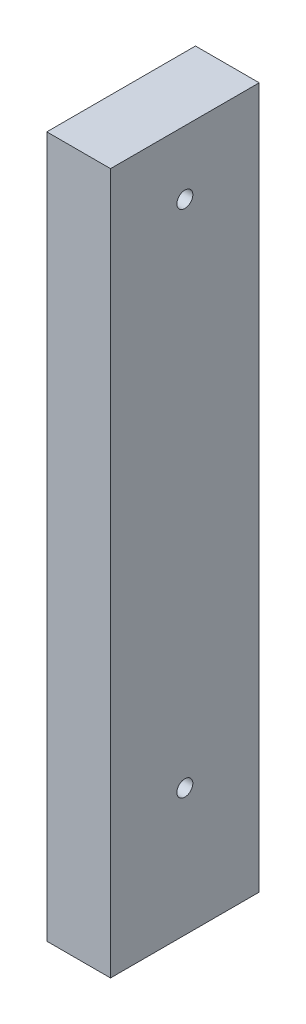
ISO-10303-21;
HEADER;
FILE_DESCRIPTION(('STEP AP214'),'2;1');
FILE_NAME('part.step','',(''),(''),'','','');
FILE_SCHEMA(('AUTOMOTIVE_DESIGN { 1 0 10303 214 1 1 1 1 }'));
ENDSEC;
DATA;
#1=APPLICATION_CONTEXT('core data for automotive mechanical design processes');
#2=APPLICATION_PROTOCOL_DEFINITION('international standard','automotive_design',2000,#1);
#3=PRODUCT_CONTEXT('',#1,'mechanical');
#4=PRODUCT('Part','Part','',(#3));
#5=PRODUCT_RELATED_PRODUCT_CATEGORY('part','',(#4));
#6=PRODUCT_DEFINITION_FORMATION('','',#4);
#7=PRODUCT_DEFINITION_CONTEXT('part definition',#1,'design');
#8=PRODUCT_DEFINITION('design','',#6,#7);
#9=PRODUCT_DEFINITION_SHAPE('','',#8);
#10=(LENGTH_UNIT() NAMED_UNIT(*) SI_UNIT(.MILLI.,.METRE.));
#11=(NAMED_UNIT(*) PLANE_ANGLE_UNIT() SI_UNIT($,.RADIAN.));
#12=(NAMED_UNIT(*) SI_UNIT($,.STERADIAN.) SOLID_ANGLE_UNIT());
#13=UNCERTAINTY_MEASURE_WITH_UNIT(LENGTH_MEASURE(1.E-05),#10,'distance_accuracy_value','');
#14=(GEOMETRIC_REPRESENTATION_CONTEXT(3) GLOBAL_UNCERTAINTY_ASSIGNED_CONTEXT((#13)) GLOBAL_UNIT_ASSIGNED_CONTEXT((#10,
#11,#12)) REPRESENTATION_CONTEXT('',''));
#15=CARTESIAN_POINT('',(0.,0.,0.));
#16=DIRECTION('',(0.,0.,1.));
#17=DIRECTION('',(1.,0.,0.));
#18=AXIS2_PLACEMENT_3D('',#15,#16,#17);
#19=CARTESIAN_POINT('',(0.,419.1,0.));
#20=DIRECTION('',(1.,0.,0.));
#21=DIRECTION('',(0.,0.,-1.));
#22=AXIS2_PLACEMENT_3D('',#19,#20,#21);
#23=PLANE('',#22);
#24=CARTESIAN_POINT('',(0.,76.2,-44.45));
#25=DIRECTION('',(-1.,0.,0.));
#26=DIRECTION('',(0.,0.,1.));
#27=AXIS2_PLACEMENT_3D('',#24,#25,#26);
#28=CIRCLE('',#27,4.7625);
#29=CARTESIAN_POINT('',(0.,76.2,-39.6875));
#30=VERTEX_POINT('',#29);
#31=EDGE_CURVE('E128',#30,#30,#28,.T.);
#32=ORIENTED_EDGE('',*,*,#31,.F.);
#33=EDGE_LOOP('',(#32));
#34=FACE_BOUND('',#33,.T.);
#35=CARTESIAN_POINT('',(0.,381.,-44.45));
#36=DIRECTION('',(-1.,0.,0.));
#37=DIRECTION('',(0.,0.,1.));
#38=AXIS2_PLACEMENT_3D('',#35,#36,#37);
#39=CIRCLE('',#38,4.7625);
#40=CARTESIAN_POINT('',(0.,381.,-39.6875));
#41=VERTEX_POINT('',#40);
#42=EDGE_CURVE('E122',#41,#41,#39,.T.);
#43=ORIENTED_EDGE('',*,*,#42,.F.);
#44=EDGE_LOOP('',(#43));
#45=FACE_BOUND('',#44,.T.);
#46=DIRECTION('',(0.,0.,1.));
#47=VECTOR('',#46,1.);
#48=CARTESIAN_POINT('',(0.,0.,0.));
#49=LINE('',#48,#47);
#50=CARTESIAN_POINT('',(0.,0.,-88.9));
#51=VERTEX_POINT('',#50);
#52=CARTESIAN_POINT('',(0.,0.,0.));
#53=VERTEX_POINT('',#52);
#54=EDGE_CURVE('E108',#51,#53,#49,.T.);
#55=ORIENTED_EDGE('',*,*,#54,.T.);
#56=DIRECTION('',(0.,-1.,0.));
#57=VECTOR('',#56,1.);
#58=CARTESIAN_POINT('',(0.,419.1,0.));
#59=LINE('',#58,#57);
#60=CARTESIAN_POINT('',(0.,419.1,0.));
#61=VERTEX_POINT('',#60);
#62=EDGE_CURVE('E14',#61,#53,#59,.T.);
#63=ORIENTED_EDGE('',*,*,#62,.F.);
#64=DIRECTION('',(0.,0.,1.));
#65=VECTOR('',#64,1.);
#66=CARTESIAN_POINT('',(0.,419.1,0.));
#67=LINE('',#66,#65);
#68=CARTESIAN_POINT('',(0.,419.1,-88.9));
#69=VERTEX_POINT('',#68);
#70=EDGE_CURVE('E96',#69,#61,#67,.T.);
#71=ORIENTED_EDGE('',*,*,#70,.F.);
#72=DIRECTION('',(0.,-1.,0.));
#73=VECTOR('',#72,1.);
#74=CARTESIAN_POINT('',(0.,419.1,-88.9));
#75=LINE('',#74,#73);
#76=EDGE_CURVE('E104',#69,#51,#75,.T.);
#77=ORIENTED_EDGE('',*,*,#76,.T.);
#78=EDGE_LOOP('',(#55,#63,#71,#77));
#79=FACE_BOUND('',#78,.T.);
#80=ADVANCED_FACE('F45',(#34,#45,#79),#23,.F.);
#81=CARTESIAN_POINT('',(0.,419.1,0.));
#82=DIRECTION('',(0.,0.,-1.));
#83=DIRECTION('',(-1.,0.,0.));
#84=AXIS2_PLACEMENT_3D('',#81,#82,#83);
#85=PLANE('',#84);
#86=DIRECTION('',(1.,0.,0.));
#87=VECTOR('',#86,1.);
#88=CARTESIAN_POINT('',(0.,0.,0.));
#89=LINE('',#88,#87);
#90=CARTESIAN_POINT('',(38.1,0.,0.));
#91=VERTEX_POINT('',#90);
#92=EDGE_CURVE('E100',#53,#91,#89,.T.);
#93=ORIENTED_EDGE('',*,*,#92,.T.);
#94=DIRECTION('',(0.,-1.,0.));
#95=VECTOR('',#94,1.);
#96=CARTESIAN_POINT('',(38.1,419.1,0.));
#97=LINE('',#96,#95);
#98=CARTESIAN_POINT('',(38.1,419.1,0.));
#99=VERTEX_POINT('',#98);
#100=EDGE_CURVE('E53',#99,#91,#97,.T.);
#101=ORIENTED_EDGE('',*,*,#100,.F.);
#102=DIRECTION('',(1.,0.,0.));
#103=VECTOR('',#102,1.);
#104=CARTESIAN_POINT('',(0.,419.1,0.));
#105=LINE('',#104,#103);
#106=EDGE_CURVE('E91',#61,#99,#105,.T.);
#107=ORIENTED_EDGE('',*,*,#106,.F.);
#108=ORIENTED_EDGE('',*,*,#62,.T.);
#109=EDGE_LOOP('',(#93,#101,#107,#108));
#110=FACE_BOUND('',#109,.T.);
#111=ADVANCED_FACE('F99',(#110),#85,.F.);
#112=CARTESIAN_POINT('',(38.1,419.1,0.));
#113=DIRECTION('',(-1.,0.,0.));
#114=DIRECTION('',(0.,0.,1.));
#115=AXIS2_PLACEMENT_3D('',#112,#113,#114);
#116=PLANE('',#115);
#117=CARTESIAN_POINT('',(38.1,76.2,-44.45));
#118=DIRECTION('',(-1.,0.,0.));
#119=DIRECTION('',(0.,0.,1.));
#120=AXIS2_PLACEMENT_3D('',#117,#118,#119);
#121=CIRCLE('',#120,4.7625);
#122=CARTESIAN_POINT('',(38.1,76.2,-39.6875));
#123=VERTEX_POINT('',#122);
#124=EDGE_CURVE('E125',#123,#123,#121,.T.);
#125=ORIENTED_EDGE('',*,*,#124,.T.);
#126=EDGE_LOOP('',(#125));
#127=FACE_BOUND('',#126,.T.);
#128=CARTESIAN_POINT('',(38.1,381.,-44.45));
#129=DIRECTION('',(-1.,0.,0.));
#130=DIRECTION('',(0.,0.,1.));
#131=AXIS2_PLACEMENT_3D('',#128,#129,#130);
#132=CIRCLE('',#131,4.7625);
#133=CARTESIAN_POINT('',(38.1,381.,-39.6875));
#134=VERTEX_POINT('',#133);
#135=EDGE_CURVE('E111',#134,#134,#132,.T.);
#136=ORIENTED_EDGE('',*,*,#135,.T.);
#137=EDGE_LOOP('',(#136));
#138=FACE_BOUND('',#137,.T.);
#139=DIRECTION('',(0.,0.,-1.));
#140=VECTOR('',#139,1.);
#141=CARTESIAN_POINT('',(38.1,0.,0.));
#142=LINE('',#141,#140);
#143=CARTESIAN_POINT('',(38.1,0.,-88.9));
#144=VERTEX_POINT('',#143);
#145=EDGE_CURVE('E78',#91,#144,#142,.T.);
#146=ORIENTED_EDGE('',*,*,#145,.T.);
#147=DIRECTION('',(0.,-1.,0.));
#148=VECTOR('',#147,1.);
#149=CARTESIAN_POINT('',(38.1,419.1,-88.9));
#150=LINE('',#149,#148);
#151=CARTESIAN_POINT('',(38.1,419.1,-88.9));
#152=VERTEX_POINT('',#151);
#153=EDGE_CURVE('E101',#152,#144,#150,.T.);
#154=ORIENTED_EDGE('',*,*,#153,.F.);
#155=DIRECTION('',(0.,0.,-1.));
#156=VECTOR('',#155,1.);
#157=CARTESIAN_POINT('',(38.1,419.1,0.));
#158=LINE('',#157,#156);
#159=EDGE_CURVE('E94',#99,#152,#158,.T.);
#160=ORIENTED_EDGE('',*,*,#159,.F.);
#161=ORIENTED_EDGE('',*,*,#100,.T.);
#162=EDGE_LOOP('',(#146,#154,#160,#161));
#163=FACE_BOUND('',#162,.T.);
#164=ADVANCED_FACE('F102',(#127,#138,#163),#116,.F.);
#165=CARTESIAN_POINT('',(0.,419.1,-88.9));
#166=DIRECTION('',(0.,0.,1.));
#167=DIRECTION('',(1.,0.,0.));
#168=AXIS2_PLACEMENT_3D('',#165,#166,#167);
#169=PLANE('',#168);
#170=DIRECTION('',(-1.,0.,0.));
#171=VECTOR('',#170,1.);
#172=CARTESIAN_POINT('',(0.,0.,-88.9));
#173=LINE('',#172,#171);
#174=EDGE_CURVE('E84',#144,#51,#173,.T.);
#175=ORIENTED_EDGE('',*,*,#174,.T.);
#176=ORIENTED_EDGE('',*,*,#76,.F.);
#177=DIRECTION('',(-1.,0.,0.));
#178=VECTOR('',#177,1.);
#179=CARTESIAN_POINT('',(0.,419.1,-88.9));
#180=LINE('',#179,#178);
#181=EDGE_CURVE('E61',#152,#69,#180,.T.);
#182=ORIENTED_EDGE('',*,*,#181,.F.);
#183=ORIENTED_EDGE('',*,*,#153,.T.);
#184=EDGE_LOOP('',(#175,#176,#182,#183));
#185=FACE_BOUND('',#184,.T.);
#186=ADVANCED_FACE('F116',(#185),#169,.F.);
#187=CARTESIAN_POINT('',(0.,419.1,0.));
#188=DIRECTION('',(0.,-1.,0.));
#189=DIRECTION('',(0.,0.,-1.));
#190=AXIS2_PLACEMENT_3D('',#187,#188,#189);
#191=PLANE('',#190);
#192=ORIENTED_EDGE('',*,*,#70,.T.);
#193=ORIENTED_EDGE('',*,*,#106,.T.);
#194=ORIENTED_EDGE('',*,*,#159,.T.);
#195=ORIENTED_EDGE('',*,*,#181,.T.);
#196=EDGE_LOOP('',(#192,#193,#194,#195));
#197=FACE_BOUND('',#196,.T.);
#198=ADVANCED_FACE('F92',(#197),#191,.F.);
#199=CARTESIAN_POINT('',(0.,0.,0.));
#200=DIRECTION('',(0.,-1.,0.));
#201=DIRECTION('',(0.,0.,-1.));
#202=AXIS2_PLACEMENT_3D('',#199,#200,#201);
#203=PLANE('',#202);
#204=ORIENTED_EDGE('',*,*,#54,.F.);
#205=ORIENTED_EDGE('',*,*,#174,.F.);
#206=ORIENTED_EDGE('',*,*,#145,.F.);
#207=ORIENTED_EDGE('',*,*,#92,.F.);
#208=EDGE_LOOP('',(#204,#205,#206,#207));
#209=FACE_BOUND('',#208,.T.);
#210=ADVANCED_FACE('F119',(#209),#203,.T.);
#211=CARTESIAN_POINT('',(38.1,381.,-44.45));
#212=DIRECTION('',(-1.,0.,0.));
#213=DIRECTION('',(0.,0.,1.));
#214=AXIS2_PLACEMENT_3D('',#211,#212,#213);
#215=CYLINDRICAL_SURFACE('',#214,4.7625);
#216=CARTESIAN_POINT('',(38.1,381.,-39.6875));
#217=CARTESIAN_POINT('',(37.703125,381.,-39.6875));
#218=CARTESIAN_POINT('',(37.30625,381.,-39.6875));
#219=CARTESIAN_POINT('',(36.5125,381.,-39.6875));
#220=CARTESIAN_POINT('',(36.115625,381.,-39.6875));
#221=CARTESIAN_POINT('',(35.321875,381.,-39.6875));
#222=CARTESIAN_POINT('',(34.925,381.,-39.6875));
#223=CARTESIAN_POINT('',(34.13125,381.,-39.6875));
#224=CARTESIAN_POINT('',(33.734375,381.,-39.6875));
#225=CARTESIAN_POINT('',(32.940625,381.,-39.6875));
#226=CARTESIAN_POINT('',(32.54375,381.,-39.6875));
#227=CARTESIAN_POINT('',(31.75,381.,-39.6875));
#228=CARTESIAN_POINT('',(31.353125,381.,-39.6875));
#229=CARTESIAN_POINT('',(30.559375,381.,-39.6875));
#230=CARTESIAN_POINT('',(30.1625,381.,-39.6875));
#231=CARTESIAN_POINT('',(29.36875,381.,-39.6875));
#232=CARTESIAN_POINT('',(28.971875,381.,-39.6875));
#233=CARTESIAN_POINT('',(28.178125,381.,-39.6875));
#234=CARTESIAN_POINT('',(27.78125,381.,-39.6875));
#235=CARTESIAN_POINT('',(26.9875,381.,-39.6875));
#236=CARTESIAN_POINT('',(26.590625,381.,-39.6875));
#237=CARTESIAN_POINT('',(25.796875,381.,-39.6875));
#238=CARTESIAN_POINT('',(25.4,381.,-39.6875));
#239=CARTESIAN_POINT('',(24.60625,381.,-39.6875));
#240=CARTESIAN_POINT('',(24.209375,381.,-39.6875));
#241=CARTESIAN_POINT('',(23.415625,381.,-39.6875));
#242=CARTESIAN_POINT('',(23.01875,381.,-39.6875));
#243=CARTESIAN_POINT('',(22.225,381.,-39.6875));
#244=CARTESIAN_POINT('',(21.828125,381.,-39.6875));
#245=CARTESIAN_POINT('',(21.034375,381.,-39.6875));
#246=CARTESIAN_POINT('',(20.6375,381.,-39.6875));
#247=CARTESIAN_POINT('',(19.84375,381.,-39.6875));
#248=CARTESIAN_POINT('',(19.446875,381.,-39.6875));
#249=CARTESIAN_POINT('',(18.653125,381.,-39.6875));
#250=CARTESIAN_POINT('',(18.25625,381.,-39.6875));
#251=CARTESIAN_POINT('',(17.4625,381.,-39.6875));
#252=CARTESIAN_POINT('',(17.065625,381.,-39.6875));
#253=CARTESIAN_POINT('',(16.271875,381.,-39.6875));
#254=CARTESIAN_POINT('',(15.875,381.,-39.6875));
#255=CARTESIAN_POINT('',(15.08125,381.,-39.6875));
#256=CARTESIAN_POINT('',(14.684375,381.,-39.6875));
#257=CARTESIAN_POINT('',(13.890625,381.,-39.6875));
#258=CARTESIAN_POINT('',(13.49375,381.,-39.6875));
#259=CARTESIAN_POINT('',(12.7,381.,-39.6875));
#260=CARTESIAN_POINT('',(12.303125,381.,-39.6875));
#261=CARTESIAN_POINT('',(11.509375,381.,-39.6875));
#262=CARTESIAN_POINT('',(11.1125,381.,-39.6875));
#263=CARTESIAN_POINT('',(10.31875,381.,-39.6875));
#264=CARTESIAN_POINT('',(9.921875,381.,-39.6875));
#265=CARTESIAN_POINT('',(9.128125,381.,-39.6875));
#266=CARTESIAN_POINT('',(8.73125,381.,-39.6875));
#267=CARTESIAN_POINT('',(7.9375,381.,-39.6875));
#268=CARTESIAN_POINT('',(7.540625,381.,-39.6875));
#269=CARTESIAN_POINT('',(6.746875,381.,-39.6875));
#270=CARTESIAN_POINT('',(6.35,381.,-39.6875));
#271=CARTESIAN_POINT('',(5.55625,381.,-39.6875));
#272=CARTESIAN_POINT('',(5.159375,381.,-39.6875));
#273=CARTESIAN_POINT('',(4.365625,381.,-39.6875));
#274=CARTESIAN_POINT('',(3.96875,381.,-39.6875));
#275=CARTESIAN_POINT('',(3.175,381.,-39.6875));
#276=CARTESIAN_POINT('',(2.778125,381.,-39.6875));
#277=CARTESIAN_POINT('',(1.984375,381.,-39.6875));
#278=CARTESIAN_POINT('',(1.5875,381.,-39.6875));
#279=CARTESIAN_POINT('',(0.79375,381.,-39.6875));
#280=CARTESIAN_POINT('',(0.396875,381.,-39.6875));
#281=CARTESIAN_POINT('',(0.,381.,-39.6875));
#282=B_SPLINE_CURVE_WITH_KNOTS('',3,(#216,#217,#218,#219,#220,#221,#222,#223,#224,#225,#226,
#227,#228,#229,#230,#231,#232,#233,#234,#235,#236,#237,#238,#239,#240,#241,#242,#243,#244,#245,
#246,#247,#248,#249,#250,#251,#252,#253,#254,#255,#256,#257,#258,#259,#260,#261,#262,#263,#264,
#265,#266,#267,#268,#269,#270,#271,#272,#273,#274,#275,#276,#277,#278,#279,#280,#281),
.UNSPECIFIED.,.F.,.F.,(4,2,2,2,2,2,2,2,2,2,2,2,2,2,2,2,2,2,2,2,2,2,2,2,2,2,2,2,2,2,2,2,4),(0.,
1.19062499999999,2.38124999999999,3.571875,4.7625,5.953125,7.14375,8.334375,9.525,10.715625,
11.90625,13.096875,14.2875,15.478125,16.66875,17.859375,19.05,20.240625,21.43125,22.621875,
23.8125,25.003125,26.19375,27.384375,28.575,29.765625,30.95625,32.146875,33.3375,34.528125,
35.71875,36.909375,38.1),.UNSPECIFIED.);
#283=EDGE_CURVE('BSEAM139',#134,#41,#282,.T.);
#284=ORIENTED_EDGE('',*,*,#135,.F.);
#285=ORIENTED_EDGE('',*,*,#42,.T.);
#286=ORIENTED_EDGE('',*,*,#283,.T.);
#287=ORIENTED_EDGE('',*,*,#283,.F.);
#288=EDGE_LOOP('',(#284,#286,#285,#287));
#289=FACE_BOUND('',#288,.T.);
#290=ADVANCED_FACE('F139',(#289),#215,.F.);
#291=CARTESIAN_POINT('',(38.1,76.2,-44.45));
#292=DIRECTION('',(-1.,0.,0.));
#293=DIRECTION('',(0.,0.,1.));
#294=AXIS2_PLACEMENT_3D('',#291,#292,#293);
#295=CYLINDRICAL_SURFACE('',#294,4.7625);
#296=CARTESIAN_POINT('',(38.1,76.2,-39.6875));
#297=CARTESIAN_POINT('',(37.703125,76.2,-39.6875));
#298=CARTESIAN_POINT('',(37.30625,76.2,-39.6875));
#299=CARTESIAN_POINT('',(36.5125,76.2,-39.6875));
#300=CARTESIAN_POINT('',(36.115625,76.2,-39.6875));
#301=CARTESIAN_POINT('',(35.321875,76.2,-39.6875));
#302=CARTESIAN_POINT('',(34.925,76.2,-39.6875));
#303=CARTESIAN_POINT('',(34.13125,76.2,-39.6875));
#304=CARTESIAN_POINT('',(33.734375,76.2,-39.6875));
#305=CARTESIAN_POINT('',(32.940625,76.2,-39.6875));
#306=CARTESIAN_POINT('',(32.54375,76.2,-39.6875));
#307=CARTESIAN_POINT('',(31.75,76.2,-39.6875));
#308=CARTESIAN_POINT('',(31.353125,76.2,-39.6875));
#309=CARTESIAN_POINT('',(30.559375,76.2,-39.6875));
#310=CARTESIAN_POINT('',(30.1625,76.2,-39.6875));
#311=CARTESIAN_POINT('',(29.36875,76.2,-39.6875));
#312=CARTESIAN_POINT('',(28.971875,76.2,-39.6875));
#313=CARTESIAN_POINT('',(28.178125,76.2,-39.6875));
#314=CARTESIAN_POINT('',(27.78125,76.2,-39.6875));
#315=CARTESIAN_POINT('',(26.9875,76.2,-39.6875));
#316=CARTESIAN_POINT('',(26.590625,76.2,-39.6875));
#317=CARTESIAN_POINT('',(25.796875,76.2,-39.6875));
#318=CARTESIAN_POINT('',(25.4,76.2,-39.6875));
#319=CARTESIAN_POINT('',(24.60625,76.2,-39.6875));
#320=CARTESIAN_POINT('',(24.209375,76.2,-39.6875));
#321=CARTESIAN_POINT('',(23.415625,76.2,-39.6875));
#322=CARTESIAN_POINT('',(23.01875,76.2,-39.6875));
#323=CARTESIAN_POINT('',(22.225,76.2,-39.6875));
#324=CARTESIAN_POINT('',(21.828125,76.2,-39.6875));
#325=CARTESIAN_POINT('',(21.034375,76.2,-39.6875));
#326=CARTESIAN_POINT('',(20.6375,76.2,-39.6875));
#327=CARTESIAN_POINT('',(19.84375,76.2,-39.6875));
#328=CARTESIAN_POINT('',(19.446875,76.2,-39.6875));
#329=CARTESIAN_POINT('',(18.653125,76.2,-39.6875));
#330=CARTESIAN_POINT('',(18.25625,76.2,-39.6875));
#331=CARTESIAN_POINT('',(17.4625,76.2,-39.6875));
#332=CARTESIAN_POINT('',(17.065625,76.2,-39.6875));
#333=CARTESIAN_POINT('',(16.271875,76.2,-39.6875));
#334=CARTESIAN_POINT('',(15.875,76.2,-39.6875));
#335=CARTESIAN_POINT('',(15.08125,76.2,-39.6875));
#336=CARTESIAN_POINT('',(14.684375,76.2,-39.6875));
#337=CARTESIAN_POINT('',(13.890625,76.2,-39.6875));
#338=CARTESIAN_POINT('',(13.49375,76.2,-39.6875));
#339=CARTESIAN_POINT('',(12.7,76.2,-39.6875));
#340=CARTESIAN_POINT('',(12.303125,76.2,-39.6875));
#341=CARTESIAN_POINT('',(11.509375,76.2,-39.6875));
#342=CARTESIAN_POINT('',(11.1125,76.2,-39.6875));
#343=CARTESIAN_POINT('',(10.31875,76.2,-39.6875));
#344=CARTESIAN_POINT('',(9.921875,76.2,-39.6875));
#345=CARTESIAN_POINT('',(9.128125,76.2,-39.6875));
#346=CARTESIAN_POINT('',(8.73125,76.2,-39.6875));
#347=CARTESIAN_POINT('',(7.9375,76.2,-39.6875));
#348=CARTESIAN_POINT('',(7.540625,76.2,-39.6875));
#349=CARTESIAN_POINT('',(6.746875,76.2,-39.6875));
#350=CARTESIAN_POINT('',(6.35,76.2,-39.6875));
#351=CARTESIAN_POINT('',(5.55625,76.2,-39.6875));
#352=CARTESIAN_POINT('',(5.159375,76.2,-39.6875));
#353=CARTESIAN_POINT('',(4.365625,76.2,-39.6875));
#354=CARTESIAN_POINT('',(3.96875,76.2,-39.6875));
#355=CARTESIAN_POINT('',(3.175,76.2,-39.6875));
#356=CARTESIAN_POINT('',(2.778125,76.2,-39.6875));
#357=CARTESIAN_POINT('',(1.984375,76.2,-39.6875));
#358=CARTESIAN_POINT('',(1.5875,76.2,-39.6875));
#359=CARTESIAN_POINT('',(0.79375,76.2,-39.6875));
#360=CARTESIAN_POINT('',(0.396875,76.2,-39.6875));
#361=CARTESIAN_POINT('',(0.,76.2,-39.6875));
#362=B_SPLINE_CURVE_WITH_KNOTS('',3,(#296,#297,#298,#299,#300,#301,#302,#303,#304,#305,#306,
#307,#308,#309,#310,#311,#312,#313,#314,#315,#316,#317,#318,#319,#320,#321,#322,#323,#324,#325,
#326,#327,#328,#329,#330,#331,#332,#333,#334,#335,#336,#337,#338,#339,#340,#341,#342,#343,#344,
#345,#346,#347,#348,#349,#350,#351,#352,#353,#354,#355,#356,#357,#358,#359,#360,#361),
.UNSPECIFIED.,.F.,.F.,(4,2,2,2,2,2,2,2,2,2,2,2,2,2,2,2,2,2,2,2,2,2,2,2,2,2,2,2,2,2,2,2,4),(0.,
1.19062499999999,2.38124999999999,3.571875,4.7625,5.953125,7.14375,8.334375,9.525,10.715625,
11.90625,13.096875,14.2875,15.478125,16.66875,17.859375,19.05,20.240625,21.43125,22.621875,
23.8125,25.003125,26.19375,27.384375,28.575,29.765625,30.95625,32.146875,33.3375,34.528125,
35.71875,36.909375,38.1),.UNSPECIFIED.);
#363=EDGE_CURVE('BSEAM136',#123,#30,#362,.T.);
#364=ORIENTED_EDGE('',*,*,#124,.F.);
#365=ORIENTED_EDGE('',*,*,#31,.T.);
#366=ORIENTED_EDGE('',*,*,#363,.T.);
#367=ORIENTED_EDGE('',*,*,#363,.F.);
#368=EDGE_LOOP('',(#364,#366,#365,#367));
#369=FACE_BOUND('',#368,.T.);
#370=ADVANCED_FACE('F136',(#369),#295,.F.);
#371=CLOSED_SHELL('',(#80,#111,#164,#186,#198,#210,#290,#370));
#372=MANIFOLD_SOLID_BREP('B2',#371);
#373=ADVANCED_BREP_SHAPE_REPRESENTATION('',(#18,#372),#14);
#374=SHAPE_DEFINITION_REPRESENTATION(#9,#373);
ENDSEC;
END-ISO-10303-21;
